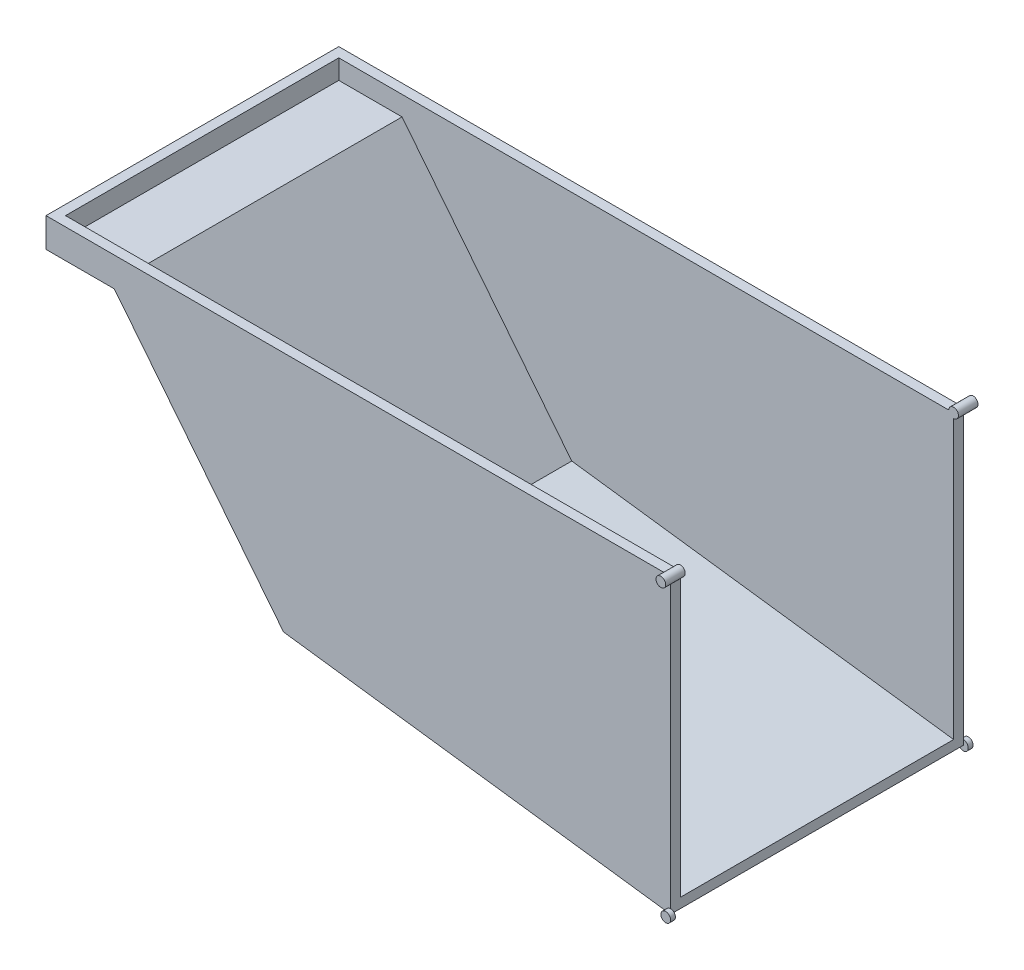
ISO-10303-21;
HEADER;
FILE_DESCRIPTION(('STEP AP214'),'2;1');
FILE_NAME('part.step','',(''),(''),'','','');
FILE_SCHEMA(('AUTOMOTIVE_DESIGN { 1 0 10303 214 1 1 1 1 }'));
ENDSEC;
DATA;
#1=APPLICATION_CONTEXT('core data for automotive mechanical design processes');
#2=APPLICATION_PROTOCOL_DEFINITION('international standard','automotive_design',2000,#1);
#3=PRODUCT_CONTEXT('',#1,'mechanical');
#4=PRODUCT('Part','Part','',(#3));
#5=PRODUCT_RELATED_PRODUCT_CATEGORY('part','',(#4));
#6=PRODUCT_DEFINITION_FORMATION('','',#4);
#7=PRODUCT_DEFINITION_CONTEXT('part definition',#1,'design');
#8=PRODUCT_DEFINITION('design','',#6,#7);
#9=PRODUCT_DEFINITION_SHAPE('','',#8);
#10=(LENGTH_UNIT() NAMED_UNIT(*) SI_UNIT(.MILLI.,.METRE.));
#11=(NAMED_UNIT(*) PLANE_ANGLE_UNIT() SI_UNIT($,.RADIAN.));
#12=(NAMED_UNIT(*) SI_UNIT($,.STERADIAN.) SOLID_ANGLE_UNIT());
#13=UNCERTAINTY_MEASURE_WITH_UNIT(LENGTH_MEASURE(1.E-05),#10,'distance_accuracy_value','');
#14=(GEOMETRIC_REPRESENTATION_CONTEXT(3) GLOBAL_UNCERTAINTY_ASSIGNED_CONTEXT((#13)) GLOBAL_UNIT_ASSIGNED_CONTEXT((#10,
#11,#12)) REPRESENTATION_CONTEXT('',''));
#15=CARTESIAN_POINT('',(0.,0.,0.));
#16=DIRECTION('',(0.,0.,1.));
#17=DIRECTION('',(1.,0.,0.));
#18=AXIS2_PLACEMENT_3D('',#15,#16,#17);
#19=CARTESIAN_POINT('',(0.,135.,150.));
#20=DIRECTION('',(0.,1.,0.));
#21=DIRECTION('',(0.,0.,1.));
#22=AXIS2_PLACEMENT_3D('',#19,#20,#21);
#23=PLANE('',#22);
#24=DIRECTION('',(0.,0.,-1.));
#25=VECTOR('',#24,1.);
#26=CARTESIAN_POINT('',(18.75,135.,0.));
#27=LINE('',#26,#25);
#28=CARTESIAN_POINT('',(18.75,135.,76.));
#29=VERTEX_POINT('',#28);
#30=CARTESIAN_POINT('',(18.75,135.,74.));
#31=VERTEX_POINT('',#30);
#32=EDGE_CURVE('E57',#29,#31,#27,.T.);
#33=ORIENTED_EDGE('',*,*,#32,.T.);
#34=DIRECTION('',(1.,0.,0.));
#35=VECTOR('',#34,1.);
#36=CARTESIAN_POINT('',(0.,135.,74.));
#37=LINE('',#36,#35);
#38=CARTESIAN_POINT('',(16.25,135.,74.));
#39=VERTEX_POINT('',#38);
#40=EDGE_CURVE('E226',#39,#31,#37,.T.);
#41=ORIENTED_EDGE('',*,*,#40,.F.);
#42=DIRECTION('',(0.,0.,-1.));
#43=VECTOR('',#42,1.);
#44=CARTESIAN_POINT('',(16.25,135.,0.));
#45=LINE('',#44,#43);
#46=CARTESIAN_POINT('',(16.25,135.,76.));
#47=VERTEX_POINT('',#46);
#48=EDGE_CURVE('E223',#47,#39,#45,.T.);
#49=ORIENTED_EDGE('',*,*,#48,.F.);
#50=DIRECTION('',(1.,0.,0.));
#51=VECTOR('',#50,1.);
#52=CARTESIAN_POINT('',(0.,135.,76.));
#53=LINE('',#52,#51);
#54=EDGE_CURVE('E232',#47,#29,#53,.T.);
#55=ORIENTED_EDGE('',*,*,#54,.T.);
#56=EDGE_LOOP('',(#33,#41,#49,#55));
#57=FACE_BOUND('',#56,.T.);
#58=DIRECTION('',(1.,0.,0.));
#59=VECTOR('',#58,1.);
#60=CARTESIAN_POINT('',(0.,135.,0.));
#61=LINE('',#60,#59);
#62=CARTESIAN_POINT('',(0.,135.,0.));
#63=VERTEX_POINT('',#62);
#64=CARTESIAN_POINT('',(35.,135.,0.));
#65=VERTEX_POINT('',#64);
#66=EDGE_CURVE('E357',#63,#65,#61,.T.);
#67=ORIENTED_EDGE('',*,*,#66,.T.);
#68=DIRECTION('',(0.,0.,-1.));
#69=VECTOR('',#68,1.);
#70=CARTESIAN_POINT('',(35.,135.,150.));
#71=LINE('',#70,#69);
#72=CARTESIAN_POINT('',(35.,135.,150.));
#73=VERTEX_POINT('',#72);
#74=EDGE_CURVE('E378',#73,#65,#71,.T.);
#75=ORIENTED_EDGE('',*,*,#74,.F.);
#76=DIRECTION('',(1.,0.,0.));
#77=VECTOR('',#76,1.);
#78=CARTESIAN_POINT('',(0.,135.,150.));
#79=LINE('',#78,#77);
#80=CARTESIAN_POINT('',(0.,135.,150.));
#81=VERTEX_POINT('',#80);
#82=EDGE_CURVE('E375',#81,#73,#79,.T.);
#83=ORIENTED_EDGE('',*,*,#82,.F.);
#84=DIRECTION('',(0.,0.,-1.));
#85=VECTOR('',#84,1.);
#86=CARTESIAN_POINT('',(0.,135.,150.));
#87=LINE('',#86,#85);
#88=EDGE_CURVE('E405',#81,#63,#87,.T.);
#89=ORIENTED_EDGE('',*,*,#88,.T.);
#90=EDGE_LOOP('',(#67,#75,#83,#89));
#91=FACE_BOUND('',#90,.T.);
#92=ADVANCED_FACE('F41',(#57,#91),#23,.F.);
#93=CARTESIAN_POINT('',(320.,-1.1842378929335E-13,150.));
#94=DIRECTION('',(-1.,0.,0.));
#95=DIRECTION('',(0.,-1.,0.));
#96=AXIS2_PLACEMENT_3D('',#93,#94,#95);
#97=PLANE('',#96);
#98=DIRECTION('',(0.,1.,0.));
#99=VECTOR('',#98,1.);
#100=CARTESIAN_POINT('',(320.,-1.1842378929335E-13,0.));
#101=LINE('',#100,#99);
#102=CARTESIAN_POINT('',(320.,0.,0.));
#103=VERTEX_POINT('',#102);
#104=CARTESIAN_POINT('',(320.,2.50000000000005,0.));
#105=VERTEX_POINT('',#104);
#106=EDGE_CURVE('E388',#103,#105,#101,.T.);
#107=ORIENTED_EDGE('',*,*,#106,.T.);
#108=CARTESIAN_POINT('',(320.,147.5,0.));
#109=VERTEX_POINT('',#108);
#110=EDGE_CURVE('E387',#105,#109,#101,.T.);
#111=ORIENTED_EDGE('',*,*,#110,.T.);
#112=DIRECTION('',(0.,0.,-1.));
#113=VECTOR('',#112,1.);
#114=CARTESIAN_POINT('',(320.,147.5,5.));
#115=LINE('',#114,#113);
#116=CARTESIAN_POINT('',(320.,147.5,5.));
#117=VERTEX_POINT('',#116);
#118=EDGE_CURVE('E266',#109,#117,#115,.F.);
#119=ORIENTED_EDGE('',*,*,#118,.T.);
#120=DIRECTION('',(0.,1.,0.));
#121=VECTOR('',#120,1.);
#122=CARTESIAN_POINT('',(320.,-1.1842378929335E-13,5.));
#123=LINE('',#122,#121);
#124=CARTESIAN_POINT('',(320.,5.04314480290078,5.));
#125=VERTEX_POINT('',#124);
#126=EDGE_CURVE('E315',#125,#117,#123,.T.);
#127=ORIENTED_EDGE('',*,*,#126,.F.);
#128=DIRECTION('',(0.,0.,-1.));
#129=VECTOR('',#128,1.);
#130=CARTESIAN_POINT('',(320.,5.04314480290078,150.));
#131=LINE('',#130,#129);
#132=CARTESIAN_POINT('',(320.,5.04314480290078,145.));
#133=VERTEX_POINT('',#132);
#134=EDGE_CURVE('E300',#133,#125,#131,.T.);
#135=ORIENTED_EDGE('',*,*,#134,.F.);
#136=DIRECTION('',(0.,1.,0.));
#137=VECTOR('',#136,1.);
#138=CARTESIAN_POINT('',(320.,-1.1842378929335E-13,145.));
#139=LINE('',#138,#137);
#140=CARTESIAN_POINT('',(320.,147.5,145.));
#141=VERTEX_POINT('',#140);
#142=EDGE_CURVE('E318',#133,#141,#139,.T.);
#143=ORIENTED_EDGE('',*,*,#142,.T.);
#144=DIRECTION('',(0.,0.,1.));
#145=VECTOR('',#144,1.);
#146=CARTESIAN_POINT('',(320.,147.5,145.));
#147=LINE('',#146,#145);
#148=CARTESIAN_POINT('',(320.,147.5,150.));
#149=VERTEX_POINT('',#148);
#150=EDGE_CURVE('E286',#141,#149,#147,.T.);
#151=ORIENTED_EDGE('',*,*,#150,.T.);
#152=DIRECTION('',(0.,1.,0.));
#153=VECTOR('',#152,1.);
#154=CARTESIAN_POINT('',(320.,-1.1842378929335E-13,150.));
#155=LINE('',#154,#153);
#156=CARTESIAN_POINT('',(320.,2.50000000000005,150.));
#157=VERTEX_POINT('',#156);
#158=EDGE_CURVE('E362',#157,#149,#155,.T.);
#159=ORIENTED_EDGE('',*,*,#158,.F.);
#160=CARTESIAN_POINT('',(320.,0.,150.));
#161=VERTEX_POINT('',#160);
#162=EDGE_CURVE('E363',#161,#157,#155,.T.);
#163=ORIENTED_EDGE('',*,*,#162,.F.);
#164=DIRECTION('',(0.,0.,-1.));
#165=VECTOR('',#164,1.);
#166=CARTESIAN_POINT('',(320.,0.,150.));
#167=LINE('',#166,#165);
#168=EDGE_CURVE('E50',#161,#103,#167,.T.);
#169=ORIENTED_EDGE('',*,*,#168,.T.);
#170=EDGE_LOOP('',(#107,#111,#119,#127,#135,#143,#151,#159,#163,#169));
#171=FACE_BOUND('',#170,.T.);
#172=ADVANCED_FACE('F415',(#171),#97,.F.);
#173=CARTESIAN_POINT('',(0.,150.,150.));
#174=DIRECTION('',(0.,1.,0.));
#175=DIRECTION('',(-1.,0.,0.));
#176=AXIS2_PLACEMENT_3D('',#173,#174,#175);
#177=PLANE('',#176);
#178=DIRECTION('',(0.,0.,-1.));
#179=VECTOR('',#178,1.);
#180=CARTESIAN_POINT('',(317.5,150.,5.));
#181=LINE('',#180,#179);
#182=CARTESIAN_POINT('',(317.5,150.,0.));
#183=VERTEX_POINT('',#182);
#184=CARTESIAN_POINT('',(317.5,150.,5.));
#185=VERTEX_POINT('',#184);
#186=EDGE_CURVE('E263',#183,#185,#181,.F.);
#187=ORIENTED_EDGE('',*,*,#186,.F.);
#188=DIRECTION('',(1.,0.,0.));
#189=VECTOR('',#188,1.);
#190=CARTESIAN_POINT('',(0.,150.,0.));
#191=LINE('',#190,#189);
#192=CARTESIAN_POINT('',(0.,150.,0.));
#193=VERTEX_POINT('',#192);
#194=EDGE_CURVE('E392',#193,#183,#191,.T.);
#195=ORIENTED_EDGE('',*,*,#194,.F.);
#196=DIRECTION('',(0.,0.,-1.));
#197=VECTOR('',#196,1.);
#198=CARTESIAN_POINT('',(0.,150.,150.));
#199=LINE('',#198,#197);
#200=CARTESIAN_POINT('',(0.,150.,150.));
#201=VERTEX_POINT('',#200);
#202=EDGE_CURVE('E408',#201,#193,#199,.T.);
#203=ORIENTED_EDGE('',*,*,#202,.F.);
#204=DIRECTION('',(1.,0.,0.));
#205=VECTOR('',#204,1.);
#206=CARTESIAN_POINT('',(0.,150.,150.));
#207=LINE('',#206,#205);
#208=CARTESIAN_POINT('',(317.5,150.,150.));
#209=VERTEX_POINT('',#208);
#210=EDGE_CURVE('E367',#201,#209,#207,.T.);
#211=ORIENTED_EDGE('',*,*,#210,.T.);
#212=DIRECTION('',(0.,0.,1.));
#213=VECTOR('',#212,1.);
#214=CARTESIAN_POINT('',(317.5,150.,145.));
#215=LINE('',#214,#213);
#216=CARTESIAN_POINT('',(317.5,150.,145.));
#217=VERTEX_POINT('',#216);
#218=EDGE_CURVE('E282',#217,#209,#215,.T.);
#219=ORIENTED_EDGE('',*,*,#218,.F.);
#220=DIRECTION('',(1.,0.,0.));
#221=VECTOR('',#220,1.);
#222=CARTESIAN_POINT('',(0.,150.,145.));
#223=LINE('',#222,#221);
#224=CARTESIAN_POINT('',(5.00000000000006,150.,145.));
#225=VERTEX_POINT('',#224);
#226=EDGE_CURVE('E322',#225,#217,#223,.T.);
#227=ORIENTED_EDGE('',*,*,#226,.F.);
#228=DIRECTION('',(0.,0.,-1.));
#229=VECTOR('',#228,1.);
#230=CARTESIAN_POINT('',(5.00000000000006,150.,150.));
#231=LINE('',#230,#229);
#232=CARTESIAN_POINT('',(5.00000000000006,150.,5.));
#233=VERTEX_POINT('',#232);
#234=EDGE_CURVE('E332',#225,#233,#231,.T.);
#235=ORIENTED_EDGE('',*,*,#234,.T.);
#236=DIRECTION('',(1.,0.,0.));
#237=VECTOR('',#236,1.);
#238=CARTESIAN_POINT('',(0.,150.,5.));
#239=LINE('',#238,#237);
#240=EDGE_CURVE('E329',#233,#185,#239,.T.);
#241=ORIENTED_EDGE('',*,*,#240,.T.);
#242=EDGE_LOOP('',(#187,#195,#203,#211,#219,#227,#235,#241));
#243=FACE_BOUND('',#242,.T.);
#244=ADVANCED_FACE('F447',(#243),#177,.T.);
#245=CARTESIAN_POINT('',(87.2046490017046,69.4395637522798,150.));
#246=DIRECTION('',(0.782285282136838,0.622920329859355,0.));
#247=DIRECTION('',(-0.622920329859355,0.782285282136838,0.));
#248=AXIS2_PLACEMENT_3D('',#245,#246,#247);
#249=PLANE('',#248);
#250=DIRECTION('',(0.622920329859355,-0.782285282136838,0.));
#251=VECTOR('',#250,1.);
#252=CARTESIAN_POINT('',(87.2046490017046,69.4395637522798,0.));
#253=LINE('',#252,#251);
#254=CARTESIAN_POINT('',(121.711027725238,26.1052384440104,0.));
#255=VERTEX_POINT('',#254);
#256=EDGE_CURVE('E299',#65,#255,#253,.T.);
#257=ORIENTED_EDGE('',*,*,#256,.T.);
#258=DIRECTION('',(0.,0.,-1.));
#259=VECTOR('',#258,1.);
#260=CARTESIAN_POINT('',(121.711027725238,26.1052384440104,150.));
#261=LINE('',#260,#259);
#262=CARTESIAN_POINT('',(121.711027725238,26.1052384440104,150.));
#263=VERTEX_POINT('',#262);
#264=EDGE_CURVE('E11',#263,#255,#261,.T.);
#265=ORIENTED_EDGE('',*,*,#264,.F.);
#266=DIRECTION('',(0.622920329859355,-0.782285282136838,0.));
#267=VECTOR('',#266,1.);
#268=CARTESIAN_POINT('',(87.2046490017046,69.4395637522798,150.));
#269=LINE('',#268,#267);
#270=EDGE_CURVE('E352',#73,#263,#269,.T.);
#271=ORIENTED_EDGE('',*,*,#270,.F.);
#272=ORIENTED_EDGE('',*,*,#74,.T.);
#273=EDGE_LOOP('',(#257,#265,#271,#272));
#274=FACE_BOUND('',#273,.T.);
#275=ADVANCED_FACE('F43',(#274),#249,.F.);
#276=CARTESIAN_POINT('',(5.4518677937491,41.4110472164034,150.));
#277=DIRECTION('',(0.130526192220052,0.99144486137381,0.));
#278=DIRECTION('',(-0.99144486137381,0.130526192220052,0.));
#279=AXIS2_PLACEMENT_3D('',#276,#277,#278);
#280=PLANE('',#279);
#281=DIRECTION('',(0.99144486137381,-0.130526192220052,0.));
#282=VECTOR('',#281,1.);
#283=CARTESIAN_POINT('',(5.4518677937491,41.4110472164034,0.));
#284=LINE('',#283,#282);
#285=CARTESIAN_POINT('',(317.521387846565,0.32631548055016,0.));
#286=VERTEX_POINT('',#285);
#287=EDGE_CURVE('E383',#255,#286,#284,.T.);
#288=ORIENTED_EDGE('',*,*,#287,.T.);
#289=EDGE_CURVE('E382',#286,#103,#284,.T.);
#290=ORIENTED_EDGE('',*,*,#289,.T.);
#291=ORIENTED_EDGE('',*,*,#168,.F.);
#292=DIRECTION('',(0.99144486137381,-0.130526192220052,0.));
#293=VECTOR('',#292,1.);
#294=CARTESIAN_POINT('',(5.4518677937491,41.4110472164034,150.));
#295=LINE('',#294,#293);
#296=CARTESIAN_POINT('',(317.521387846565,0.326315480550164,150.));
#297=VERTEX_POINT('',#296);
#298=EDGE_CURVE('E356',#297,#161,#295,.T.);
#299=ORIENTED_EDGE('',*,*,#298,.F.);
#300=EDGE_CURVE('E358',#263,#297,#295,.T.);
#301=ORIENTED_EDGE('',*,*,#300,.F.);
#302=ORIENTED_EDGE('',*,*,#264,.T.);
#303=EDGE_LOOP('',(#288,#290,#291,#299,#301,#302));
#304=FACE_BOUND('',#303,.T.);
#305=ADVANCED_FACE('F420',(#304),#280,.F.);
#306=CARTESIAN_POINT('',(0.,0.,150.));
#307=DIRECTION('',(-1.,0.,0.));
#308=DIRECTION('',(0.,-1.,0.));
#309=AXIS2_PLACEMENT_3D('',#306,#307,#308);
#310=PLANE('',#309);
#311=DIRECTION('',(0.,1.,0.));
#312=VECTOR('',#311,1.);
#313=CARTESIAN_POINT('',(0.,0.,0.));
#314=LINE('',#313,#312);
#315=EDGE_CURVE('E396',#63,#193,#314,.T.);
#316=ORIENTED_EDGE('',*,*,#315,.F.);
#317=ORIENTED_EDGE('',*,*,#88,.F.);
#318=DIRECTION('',(0.,1.,0.));
#319=VECTOR('',#318,1.);
#320=CARTESIAN_POINT('',(0.,0.,150.));
#321=LINE('',#320,#319);
#322=EDGE_CURVE('E371',#81,#201,#321,.T.);
#323=ORIENTED_EDGE('',*,*,#322,.T.);
#324=ORIENTED_EDGE('',*,*,#202,.T.);
#325=EDGE_LOOP('',(#316,#317,#323,#324));
#326=FACE_BOUND('',#325,.T.);
#327=ADVANCED_FACE('F493',(#326),#310,.T.);
#328=CARTESIAN_POINT('',(0.,0.,150.));
#329=DIRECTION('',(0.,0.,1.));
#330=DIRECTION('',(1.,0.,0.));
#331=AXIS2_PLACEMENT_3D('',#328,#329,#330);
#332=PLANE('',#331);
#333=ORIENTED_EDGE('',*,*,#300,.T.);
#334=CARTESIAN_POINT('',(320.,0.,150.));
#335=DIRECTION('',(0.,0.,1.));
#336=DIRECTION('',(1.,0.,0.));
#337=AXIS2_PLACEMENT_3D('',#334,#335,#336);
#338=CIRCLE('',#337,2.50000000000002);
#339=EDGE_CURVE('E249',#157,#297,#338,.T.);
#340=ORIENTED_EDGE('',*,*,#339,.F.);
#341=ORIENTED_EDGE('',*,*,#158,.T.);
#342=CARTESIAN_POINT('',(320.,150.,150.));
#343=DIRECTION('',(0.,0.,1.));
#344=DIRECTION('',(1.,0.,0.));
#345=AXIS2_PLACEMENT_3D('',#342,#343,#344);
#346=CIRCLE('',#345,2.50000000000002);
#347=EDGE_CURVE('E278',#209,#149,#346,.T.);
#348=ORIENTED_EDGE('',*,*,#347,.F.);
#349=ORIENTED_EDGE('',*,*,#210,.F.);
#350=ORIENTED_EDGE('',*,*,#322,.F.);
#351=ORIENTED_EDGE('',*,*,#82,.T.);
#352=ORIENTED_EDGE('',*,*,#270,.T.);
#353=EDGE_LOOP('',(#333,#340,#341,#348,#349,#350,#351,#352));
#354=FACE_BOUND('',#353,.T.);
#355=ADVANCED_FACE('F436',(#354),#332,.T.);
#356=CARTESIAN_POINT('',(0.,0.,0.));
#357=DIRECTION('',(0.,0.,1.));
#358=DIRECTION('',(1.,0.,0.));
#359=AXIS2_PLACEMENT_3D('',#356,#357,#358);
#360=PLANE('',#359);
#361=ORIENTED_EDGE('',*,*,#110,.F.);
#362=CARTESIAN_POINT('',(320.,0.,0.));
#363=DIRECTION('',(0.,0.,1.));
#364=DIRECTION('',(1.,0.,0.));
#365=AXIS2_PLACEMENT_3D('',#362,#363,#364);
#366=CIRCLE('',#365,2.50000000000002);
#367=EDGE_CURVE('E240',#105,#286,#366,.T.);
#368=ORIENTED_EDGE('',*,*,#367,.T.);
#369=ORIENTED_EDGE('',*,*,#287,.F.);
#370=ORIENTED_EDGE('',*,*,#256,.F.);
#371=ORIENTED_EDGE('',*,*,#66,.F.);
#372=ORIENTED_EDGE('',*,*,#315,.T.);
#373=ORIENTED_EDGE('',*,*,#194,.T.);
#374=CARTESIAN_POINT('',(320.,150.,0.));
#375=DIRECTION('',(0.,0.,1.));
#376=DIRECTION('',(1.,0.,0.));
#377=AXIS2_PLACEMENT_3D('',#374,#375,#376);
#378=CIRCLE('',#377,2.50000000000002);
#379=EDGE_CURVE('E259',#183,#109,#378,.T.);
#380=ORIENTED_EDGE('',*,*,#379,.T.);
#381=EDGE_LOOP('',(#361,#368,#369,#370,#371,#372,#373,#380));
#382=FACE_BOUND('',#381,.T.);
#383=ADVANCED_FACE('F430',(#382),#360,.F.);
#384=CARTESIAN_POINT('',(91.1160754123888,72.5541654015766,150.));
#385=DIRECTION('',(0.782285282136838,0.622920329859355,0.));
#386=DIRECTION('',(-0.622920329859355,0.782285282136838,0.));
#387=AXIS2_PLACEMENT_3D('',#384,#385,#386);
#388=PLANE('',#387);
#389=DIRECTION('',(0.622920329859355,-0.782285282136838,0.));
#390=VECTOR('',#389,1.);
#391=CARTESIAN_POINT('',(91.1160754123888,72.5541654015766,5.));
#392=LINE('',#391,#390);
#393=CARTESIAN_POINT('',(37.4101160967175,140.,5.));
#394=VERTEX_POINT('',#393);
#395=CARTESIAN_POINT('',(124.365012543758,30.798979516994,5.));
#396=VERTEX_POINT('',#395);
#397=EDGE_CURVE('E290',#394,#396,#392,.T.);
#398=ORIENTED_EDGE('',*,*,#397,.F.);
#399=DIRECTION('',(0.,0.,-1.));
#400=VECTOR('',#399,1.);
#401=CARTESIAN_POINT('',(37.4101160967175,140.,150.));
#402=LINE('',#401,#400);
#403=CARTESIAN_POINT('',(37.4101160967175,140.,145.));
#404=VERTEX_POINT('',#403);
#405=EDGE_CURVE('E307',#404,#394,#402,.T.);
#406=ORIENTED_EDGE('',*,*,#405,.F.);
#407=DIRECTION('',(0.622920329859355,-0.782285282136838,0.));
#408=VECTOR('',#407,1.);
#409=CARTESIAN_POINT('',(91.1160754123888,72.5541654015766,145.));
#410=LINE('',#409,#408);
#411=CARTESIAN_POINT('',(124.365012543758,30.798979516994,145.));
#412=VERTEX_POINT('',#411);
#413=EDGE_CURVE('E301',#404,#412,#410,.T.);
#414=ORIENTED_EDGE('',*,*,#413,.T.);
#415=DIRECTION('',(0.,0.,-1.));
#416=VECTOR('',#415,1.);
#417=CARTESIAN_POINT('',(124.365012543758,30.798979516994,150.));
#418=LINE('',#417,#416);
#419=EDGE_CURVE('E295',#412,#396,#418,.T.);
#420=ORIENTED_EDGE('',*,*,#419,.T.);
#421=EDGE_LOOP('',(#398,#406,#414,#420));
#422=FACE_BOUND('',#421,.T.);
#423=ADVANCED_FACE('F470',(#422),#388,.T.);
#424=CARTESIAN_POINT('',(6.10449875484936,46.3682715232725,150.));
#425=DIRECTION('',(0.130526192220052,0.99144486137381,0.));
#426=DIRECTION('',(-0.99144486137381,0.130526192220052,0.));
#427=AXIS2_PLACEMENT_3D('',#424,#425,#426);
#428=PLANE('',#427);
#429=DIRECTION('',(0.99144486137381,-0.130526192220052,0.));
#430=VECTOR('',#429,1.);
#431=CARTESIAN_POINT('',(6.10449875484936,46.3682715232725,5.));
#432=LINE('',#431,#430);
#433=EDGE_CURVE('E294',#396,#125,#432,.T.);
#434=ORIENTED_EDGE('',*,*,#433,.F.);
#435=ORIENTED_EDGE('',*,*,#419,.F.);
#436=DIRECTION('',(0.99144486137381,-0.130526192220052,0.));
#437=VECTOR('',#436,1.);
#438=CARTESIAN_POINT('',(6.10449875484936,46.3682715232725,145.));
#439=LINE('',#438,#437);
#440=EDGE_CURVE('E305',#412,#133,#439,.T.);
#441=ORIENTED_EDGE('',*,*,#440,.T.);
#442=ORIENTED_EDGE('',*,*,#134,.T.);
#443=EDGE_LOOP('',(#434,#435,#441,#442));
#444=FACE_BOUND('',#443,.T.);
#445=ADVANCED_FACE('F465',(#444),#428,.T.);
#446=CARTESIAN_POINT('',(5.,0.,150.));
#447=DIRECTION('',(-1.,0.,0.));
#448=DIRECTION('',(0.,-1.,0.));
#449=AXIS2_PLACEMENT_3D('',#446,#447,#448);
#450=PLANE('',#449);
#451=DIRECTION('',(0.,1.,0.));
#452=VECTOR('',#451,1.);
#453=CARTESIAN_POINT('',(5.,0.,5.));
#454=LINE('',#453,#452);
#455=CARTESIAN_POINT('',(5.00000000000005,140.,5.));
#456=VERTEX_POINT('',#455);
#457=EDGE_CURVE('E325',#456,#233,#454,.T.);
#458=ORIENTED_EDGE('',*,*,#457,.T.);
#459=ORIENTED_EDGE('',*,*,#234,.F.);
#460=DIRECTION('',(0.,1.,0.));
#461=VECTOR('',#460,1.);
#462=CARTESIAN_POINT('',(5.,0.,145.));
#463=LINE('',#462,#461);
#464=CARTESIAN_POINT('',(5.00000000000005,140.,145.));
#465=VERTEX_POINT('',#464);
#466=EDGE_CURVE('E319',#465,#225,#463,.T.);
#467=ORIENTED_EDGE('',*,*,#466,.F.);
#468=DIRECTION('',(0.,0.,-1.));
#469=VECTOR('',#468,1.);
#470=CARTESIAN_POINT('',(5.00000000000005,140.,150.));
#471=LINE('',#470,#469);
#472=EDGE_CURVE('E311',#465,#456,#471,.T.);
#473=ORIENTED_EDGE('',*,*,#472,.T.);
#474=EDGE_LOOP('',(#458,#459,#467,#473));
#475=FACE_BOUND('',#474,.T.);
#476=ADVANCED_FACE('F455',(#475),#450,.F.);
#477=CARTESIAN_POINT('',(0.,140.,150.));
#478=DIRECTION('',(0.,1.,0.));
#479=DIRECTION('',(0.,0.,1.));
#480=AXIS2_PLACEMENT_3D('',#477,#478,#479);
#481=PLANE('',#480);
#482=DIRECTION('',(1.,0.,0.));
#483=VECTOR('',#482,1.);
#484=CARTESIAN_POINT('',(0.,140.,5.));
#485=LINE('',#484,#483);
#486=EDGE_CURVE('E306',#456,#394,#485,.T.);
#487=ORIENTED_EDGE('',*,*,#486,.F.);
#488=ORIENTED_EDGE('',*,*,#472,.F.);
#489=DIRECTION('',(1.,0.,0.));
#490=VECTOR('',#489,1.);
#491=CARTESIAN_POINT('',(0.,140.,145.));
#492=LINE('',#491,#490);
#493=EDGE_CURVE('E312',#465,#404,#492,.T.);
#494=ORIENTED_EDGE('',*,*,#493,.T.);
#495=ORIENTED_EDGE('',*,*,#405,.T.);
#496=EDGE_LOOP('',(#487,#488,#494,#495));
#497=FACE_BOUND('',#496,.T.);
#498=ADVANCED_FACE('F473',(#497),#481,.T.);
#499=CARTESIAN_POINT('',(0.,0.,145.));
#500=DIRECTION('',(0.,0.,1.));
#501=DIRECTION('',(1.,0.,0.));
#502=AXIS2_PLACEMENT_3D('',#499,#500,#501);
#503=PLANE('',#502);
#504=ORIENTED_EDGE('',*,*,#226,.T.);
#505=CARTESIAN_POINT('',(320.,150.,145.));
#506=DIRECTION('',(0.,0.,1.));
#507=DIRECTION('',(1.,0.,0.));
#508=AXIS2_PLACEMENT_3D('',#505,#506,#507);
#509=CIRCLE('',#508,2.50000000000002);
#510=EDGE_CURVE('E274',#141,#217,#509,.T.);
#511=ORIENTED_EDGE('',*,*,#510,.F.);
#512=ORIENTED_EDGE('',*,*,#142,.F.);
#513=ORIENTED_EDGE('',*,*,#440,.F.);
#514=ORIENTED_EDGE('',*,*,#413,.F.);
#515=ORIENTED_EDGE('',*,*,#493,.F.);
#516=ORIENTED_EDGE('',*,*,#466,.T.);
#517=EDGE_LOOP('',(#504,#511,#512,#513,#514,#515,#516));
#518=FACE_BOUND('',#517,.T.);
#519=ADVANCED_FACE('F449',(#518),#503,.F.);
#520=CARTESIAN_POINT('',(0.,0.,5.));
#521=DIRECTION('',(0.,0.,1.));
#522=DIRECTION('',(1.,0.,0.));
#523=AXIS2_PLACEMENT_3D('',#520,#521,#522);
#524=PLANE('',#523);
#525=ORIENTED_EDGE('',*,*,#126,.T.);
#526=CARTESIAN_POINT('',(320.,150.,5.));
#527=DIRECTION('',(0.,0.,-1.));
#528=DIRECTION('',(-1.,0.,0.));
#529=AXIS2_PLACEMENT_3D('',#526,#527,#528);
#530=CIRCLE('',#529,2.50000000000002);
#531=EDGE_CURVE('E256',#185,#117,#530,.T.);
#532=ORIENTED_EDGE('',*,*,#531,.F.);
#533=ORIENTED_EDGE('',*,*,#240,.F.);
#534=ORIENTED_EDGE('',*,*,#457,.F.);
#535=ORIENTED_EDGE('',*,*,#486,.T.);
#536=ORIENTED_EDGE('',*,*,#397,.T.);
#537=ORIENTED_EDGE('',*,*,#433,.T.);
#538=EDGE_LOOP('',(#525,#532,#533,#534,#535,#536,#537));
#539=FACE_BOUND('',#538,.T.);
#540=ADVANCED_FACE('F460',(#539),#524,.T.);
#541=CARTESIAN_POINT('',(320.,150.,145.));
#542=DIRECTION('',(0.,0.,1.));
#543=DIRECTION('',(1.,0.,0.));
#544=AXIS2_PLACEMENT_3D('',#541,#542,#543);
#545=CYLINDRICAL_SURFACE('',#544,2.50000000000002);
#546=CARTESIAN_POINT('',(320.,150.,155.));
#547=DIRECTION('',(0.,0.,1.));
#548=DIRECTION('',(1.,0.,0.));
#549=AXIS2_PLACEMENT_3D('',#546,#547,#548);
#550=CIRCLE('',#549,2.50000000000002);
#551=CARTESIAN_POINT('',(322.5,150.,155.));
#552=VERTEX_POINT('',#551);
#553=EDGE_CURVE('E270',#552,#552,#550,.T.);
#554=ORIENTED_EDGE('',*,*,#553,.F.);
#555=EDGE_LOOP('',(#554));
#556=FACE_BOUND('',#555,.T.);
#557=ORIENTED_EDGE('',*,*,#150,.F.);
#558=ORIENTED_EDGE('',*,*,#510,.T.);
#559=ORIENTED_EDGE('',*,*,#218,.T.);
#560=ORIENTED_EDGE('',*,*,#347,.T.);
#561=EDGE_LOOP('',(#557,#558,#559,#560));
#562=FACE_BOUND('',#561,.T.);
#563=ADVANCED_FACE('F443',(#556,#562),#545,.T.);
#564=CARTESIAN_POINT('',(320.,150.,155.));
#565=DIRECTION('',(0.,0.,1.));
#566=DIRECTION('',(1.,0.,0.));
#567=AXIS2_PLACEMENT_3D('',#564,#565,#566);
#568=PLANE('',#567);
#569=ORIENTED_EDGE('',*,*,#553,.T.);
#570=EDGE_LOOP('',(#569));
#571=FACE_BOUND('',#570,.T.);
#572=ADVANCED_FACE('F655',(#571),#568,.T.);
#573=CARTESIAN_POINT('',(320.,150.,5.));
#574=DIRECTION('',(0.,0.,-1.));
#575=DIRECTION('',(-1.,0.,0.));
#576=AXIS2_PLACEMENT_3D('',#573,#574,#575);
#577=CYLINDRICAL_SURFACE('',#576,2.50000000000002);
#578=CARTESIAN_POINT('',(320.,150.,-5.));
#579=DIRECTION('',(0.,0.,-1.));
#580=DIRECTION('',(-1.,0.,0.));
#581=AXIS2_PLACEMENT_3D('',#578,#579,#580);
#582=CIRCLE('',#581,2.50000000000002);
#583=CARTESIAN_POINT('',(317.5,150.,-5.));
#584=VERTEX_POINT('',#583);
#585=EDGE_CURVE('E248',#584,#584,#582,.T.);
#586=ORIENTED_EDGE('',*,*,#585,.F.);
#587=EDGE_LOOP('',(#586));
#588=FACE_BOUND('',#587,.T.);
#589=ORIENTED_EDGE('',*,*,#118,.F.);
#590=ORIENTED_EDGE('',*,*,#379,.F.);
#591=ORIENTED_EDGE('',*,*,#186,.T.);
#592=ORIENTED_EDGE('',*,*,#531,.T.);
#593=EDGE_LOOP('',(#589,#590,#591,#592));
#594=FACE_BOUND('',#593,.T.);
#595=ADVANCED_FACE('F463',(#588,#594),#577,.T.);
#596=CARTESIAN_POINT('',(320.,150.,-5.));
#597=DIRECTION('',(0.,0.,-1.));
#598=DIRECTION('',(-1.,0.,0.));
#599=AXIS2_PLACEMENT_3D('',#596,#597,#598);
#600=PLANE('',#599);
#601=ORIENTED_EDGE('',*,*,#585,.T.);
#602=EDGE_LOOP('',(#601));
#603=FACE_BOUND('',#602,.T.);
#604=ADVANCED_FACE('F645',(#603),#600,.T.);
#605=CARTESIAN_POINT('',(320.,0.,150.));
#606=DIRECTION('',(0.,0.,1.));
#607=DIRECTION('',(1.,0.,0.));
#608=AXIS2_PLACEMENT_3D('',#605,#606,#607);
#609=PLANE('',#608);
#610=ORIENTED_EDGE('',*,*,#298,.T.);
#611=ORIENTED_EDGE('',*,*,#162,.T.);
#612=EDGE_CURVE('E239',#297,#157,#338,.T.);
#613=ORIENTED_EDGE('',*,*,#612,.F.);
#614=EDGE_LOOP('',(#610,#611,#613));
#615=FACE_BOUND('',#614,.T.);
#616=ADVANCED_FACE('F642',(#615),#609,.F.);
#617=CARTESIAN_POINT('',(320.,0.,152.5));
#618=DIRECTION('',(0.,0.,-1.));
#619=DIRECTION('',(-1.,0.,0.));
#620=AXIS2_PLACEMENT_3D('',#617,#618,#619);
#621=CYLINDRICAL_SURFACE('',#620,2.50000000000002);
#622=CARTESIAN_POINT('',(320.,0.,152.5));
#623=DIRECTION('',(0.,0.,1.));
#624=DIRECTION('',(1.,0.,0.));
#625=AXIS2_PLACEMENT_3D('',#622,#623,#624);
#626=CIRCLE('',#625,2.50000000000002);
#627=CARTESIAN_POINT('',(322.5,0.,152.5));
#628=VERTEX_POINT('',#627);
#629=EDGE_CURVE('E244',#628,#628,#626,.T.);
#630=ORIENTED_EDGE('',*,*,#629,.F.);
#631=EDGE_LOOP('',(#630));
#632=FACE_BOUND('',#631,.T.);
#633=ORIENTED_EDGE('',*,*,#339,.T.);
#634=ORIENTED_EDGE('',*,*,#612,.T.);
#635=EDGE_LOOP('',(#633,#634));
#636=FACE_BOUND('',#635,.T.);
#637=ADVANCED_FACE('F640',(#632,#636),#621,.T.);
#638=CARTESIAN_POINT('',(320.,0.,152.5));
#639=DIRECTION('',(0.,0.,1.));
#640=DIRECTION('',(1.,0.,0.));
#641=AXIS2_PLACEMENT_3D('',#638,#639,#640);
#642=PLANE('',#641);
#643=ORIENTED_EDGE('',*,*,#629,.T.);
#644=EDGE_LOOP('',(#643));
#645=FACE_BOUND('',#644,.T.);
#646=ADVANCED_FACE('F530',(#645),#642,.T.);
#647=CARTESIAN_POINT('',(320.,0.,0.));
#648=DIRECTION('',(0.,0.,-1.));
#649=DIRECTION('',(1.,0.,0.));
#650=AXIS2_PLACEMENT_3D('',#647,#648,#649);
#651=PLANE('',#650);
#652=EDGE_CURVE('E64',#286,#105,#366,.T.);
#653=ORIENTED_EDGE('',*,*,#652,.T.);
#654=ORIENTED_EDGE('',*,*,#106,.F.);
#655=ORIENTED_EDGE('',*,*,#289,.F.);
#656=EDGE_LOOP('',(#653,#654,#655));
#657=FACE_BOUND('',#656,.T.);
#658=ADVANCED_FACE('F426',(#657),#651,.F.);
#659=CARTESIAN_POINT('',(320.,0.,-2.5));
#660=DIRECTION('',(0.,0.,1.));
#661=DIRECTION('',(1.,0.,0.));
#662=AXIS2_PLACEMENT_3D('',#659,#660,#661);
#663=CYLINDRICAL_SURFACE('',#662,2.50000000000002);
#664=CARTESIAN_POINT('',(320.,0.,-2.5));
#665=DIRECTION('',(0.,0.,1.));
#666=DIRECTION('',(1.,0.,0.));
#667=AXIS2_PLACEMENT_3D('',#664,#665,#666);
#668=CIRCLE('',#667,2.50000000000002);
#669=CARTESIAN_POINT('',(322.5,0.,-2.5));
#670=VERTEX_POINT('',#669);
#671=EDGE_CURVE('E235',#670,#670,#668,.T.);
#672=ORIENTED_EDGE('',*,*,#671,.T.);
#673=EDGE_LOOP('',(#672));
#674=FACE_BOUND('',#673,.T.);
#675=ORIENTED_EDGE('',*,*,#367,.F.);
#676=ORIENTED_EDGE('',*,*,#652,.F.);
#677=EDGE_LOOP('',(#675,#676));
#678=FACE_BOUND('',#677,.T.);
#679=ADVANCED_FACE('F428',(#674,#678),#663,.T.);
#680=CARTESIAN_POINT('',(320.,0.,-2.5));
#681=DIRECTION('',(0.,0.,-1.));
#682=DIRECTION('',(1.,0.,0.));
#683=AXIS2_PLACEMENT_3D('',#680,#681,#682);
#684=PLANE('',#683);
#685=ORIENTED_EDGE('',*,*,#671,.F.);
#686=EDGE_LOOP('',(#685));
#687=FACE_BOUND('',#686,.T.);
#688=ADVANCED_FACE('F563',(#687),#684,.T.);
#689=CARTESIAN_POINT('',(0.,129.5,74.));
#690=DIRECTION('',(0.,0.,1.));
#691=DIRECTION('',(1.,0.,0.));
#692=AXIS2_PLACEMENT_3D('',#689,#690,#691);
#693=PLANE('',#692);
#694=CARTESIAN_POINT('',(17.5,131.,74.));
#695=DIRECTION('',(0.,0.,1.));
#696=DIRECTION('',(1.,0.,0.));
#697=AXIS2_PLACEMENT_3D('',#694,#695,#696);
#698=CIRCLE('',#697,0.750000000000002);
#699=CARTESIAN_POINT('',(18.25,131.,74.));
#700=VERTEX_POINT('',#699);
#701=EDGE_CURVE('E219',#700,#700,#698,.T.);
#702=ORIENTED_EDGE('',*,*,#701,.T.);
#703=EDGE_LOOP('',(#702));
#704=FACE_BOUND('',#703,.T.);
#705=CARTESIAN_POINT('',(17.5,131.,74.));
#706=DIRECTION('',(0.,0.,1.));
#707=DIRECTION('',(1.,0.,0.));
#708=AXIS2_PLACEMENT_3D('',#705,#706,#707);
#709=CIRCLE('',#708,1.);
#710=CARTESIAN_POINT('',(18.4980823115217,130.938099277649,74.));
#711=VERTEX_POINT('',#710);
#712=CARTESIAN_POINT('',(16.5019176884783,130.938099277649,74.));
#713=VERTEX_POINT('',#712);
#714=EDGE_CURVE('E187',#711,#713,#709,.F.);
#715=ORIENTED_EDGE('',*,*,#714,.T.);
#716=DIRECTION('',(-0.0619007223505273,0.998082311521692,0.));
#717=VECTOR('',#716,1.);
#718=CARTESIAN_POINT('',(16.5275359725695,130.525032107639,74.));
#719=LINE('',#718,#717);
#720=EDGE_CURVE('E215',#713,#39,#719,.T.);
#721=ORIENTED_EDGE('',*,*,#720,.T.);
#722=ORIENTED_EDGE('',*,*,#40,.T.);
#723=DIRECTION('',(-0.0619007223505273,-0.998082311521692,0.));
#724=VECTOR('',#723,1.);
#725=CARTESIAN_POINT('',(18.3383545474674,128.362661545942,74.));
#726=LINE('',#725,#724);
#727=EDGE_CURVE('E209',#31,#711,#726,.T.);
#728=ORIENTED_EDGE('',*,*,#727,.T.);
#729=EDGE_LOOP('',(#715,#721,#722,#728));
#730=FACE_BOUND('',#729,.T.);
#731=ADVANCED_FACE('F572',(#704,#730),#693,.F.);
#732=CARTESIAN_POINT('',(0.,129.5,76.));
#733=DIRECTION('',(0.,0.,1.));
#734=DIRECTION('',(1.,0.,0.));
#735=AXIS2_PLACEMENT_3D('',#732,#733,#734);
#736=PLANE('',#735);
#737=CARTESIAN_POINT('',(17.5,131.,76.));
#738=DIRECTION('',(0.,0.,1.));
#739=DIRECTION('',(1.,0.,0.));
#740=AXIS2_PLACEMENT_3D('',#737,#738,#739);
#741=CIRCLE('',#740,0.750000000000002);
#742=CARTESIAN_POINT('',(18.25,131.,76.));
#743=VERTEX_POINT('',#742);
#744=EDGE_CURVE('E199',#743,#743,#741,.T.);
#745=ORIENTED_EDGE('',*,*,#744,.F.);
#746=EDGE_LOOP('',(#745));
#747=FACE_BOUND('',#746,.T.);
#748=DIRECTION('',(-0.0619007223505274,0.998082311521692,0.));
#749=VECTOR('',#748,1.);
#750=CARTESIAN_POINT('',(16.25,135.,76.));
#751=LINE('',#750,#749);
#752=CARTESIAN_POINT('',(16.5019176884783,130.938099277649,76.));
#753=VERTEX_POINT('',#752);
#754=EDGE_CURVE('E191',#753,#47,#751,.T.);
#755=ORIENTED_EDGE('',*,*,#754,.F.);
#756=CARTESIAN_POINT('',(17.5,131.,76.));
#757=DIRECTION('',(0.,0.,-1.));
#758=DIRECTION('',(1.,0.,0.));
#759=AXIS2_PLACEMENT_3D('',#756,#757,#758);
#760=CIRCLE('',#759,1.);
#761=CARTESIAN_POINT('',(18.4980823115217,130.938099277649,76.));
#762=VERTEX_POINT('',#761);
#763=EDGE_CURVE('E184',#762,#753,#760,.T.);
#764=ORIENTED_EDGE('',*,*,#763,.F.);
#765=DIRECTION('',(-0.0619007223505274,-0.998082311521692,0.));
#766=VECTOR('',#765,1.);
#767=CARTESIAN_POINT('',(18.75,135.,76.));
#768=LINE('',#767,#766);
#769=EDGE_CURVE('E193',#29,#762,#768,.T.);
#770=ORIENTED_EDGE('',*,*,#769,.F.);
#771=ORIENTED_EDGE('',*,*,#54,.F.);
#772=EDGE_LOOP('',(#755,#764,#770,#771));
#773=FACE_BOUND('',#772,.T.);
#774=ADVANCED_FACE('F201',(#747,#773),#736,.T.);
#775=CARTESIAN_POINT('',(16.25,135.,70.5));
#776=DIRECTION('',(0.998082311521692,0.0619007223505273,0.));
#777=DIRECTION('',(-0.0619007223505273,0.998082311521692,0.));
#778=AXIS2_PLACEMENT_3D('',#775,#776,#777);
#779=PLANE('',#778);
#780=DIRECTION('',(0.,0.,1.));
#781=VECTOR('',#780,1.);
#782=CARTESIAN_POINT('',(16.5019176884783,130.938099277649,70.5));
#783=LINE('',#782,#781);
#784=EDGE_CURVE('E190',#713,#753,#783,.T.);
#785=ORIENTED_EDGE('',*,*,#784,.T.);
#786=ORIENTED_EDGE('',*,*,#754,.T.);
#787=ORIENTED_EDGE('',*,*,#48,.T.);
#788=ORIENTED_EDGE('',*,*,#720,.F.);
#789=EDGE_LOOP('',(#785,#786,#787,#788));
#790=FACE_BOUND('',#789,.T.);
#791=ADVANCED_FACE('F596',(#790),#779,.F.);
#792=CARTESIAN_POINT('',(17.5,131.,70.5));
#793=DIRECTION('',(0.,0.,1.));
#794=DIRECTION('',(1.,0.,0.));
#795=AXIS2_PLACEMENT_3D('',#792,#793,#794);
#796=CYLINDRICAL_SURFACE('',#795,1.);
#797=DIRECTION('',(0.,0.,1.));
#798=VECTOR('',#797,1.);
#799=CARTESIAN_POINT('',(18.4980823115217,130.938099277649,70.5));
#800=LINE('',#799,#798);
#801=EDGE_CURVE('E180',#711,#762,#800,.T.);
#802=ORIENTED_EDGE('',*,*,#801,.T.);
#803=ORIENTED_EDGE('',*,*,#763,.T.);
#804=ORIENTED_EDGE('',*,*,#784,.F.);
#805=ORIENTED_EDGE('',*,*,#714,.F.);
#806=EDGE_LOOP('',(#802,#803,#804,#805));
#807=FACE_BOUND('',#806,.T.);
#808=ADVANCED_FACE('F181',(#807),#796,.T.);
#809=CARTESIAN_POINT('',(18.75,135.,70.5));
#810=DIRECTION('',(-0.998082311521692,0.0619007223505273,0.));
#811=DIRECTION('',(-0.0619007223505273,-0.998082311521692,0.));
#812=AXIS2_PLACEMENT_3D('',#809,#810,#811);
#813=PLANE('',#812);
#814=ORIENTED_EDGE('',*,*,#32,.F.);
#815=ORIENTED_EDGE('',*,*,#769,.T.);
#816=ORIENTED_EDGE('',*,*,#801,.F.);
#817=ORIENTED_EDGE('',*,*,#727,.F.);
#818=EDGE_LOOP('',(#814,#815,#816,#817));
#819=FACE_BOUND('',#818,.T.);
#820=ADVANCED_FACE('F194',(#819),#813,.F.);
#821=CARTESIAN_POINT('',(17.5,131.,70.5));
#822=DIRECTION('',(0.,0.,1.));
#823=DIRECTION('',(1.,0.,0.));
#824=AXIS2_PLACEMENT_3D('',#821,#822,#823);
#825=CYLINDRICAL_SURFACE('',#824,0.750000000000002);
#826=ORIENTED_EDGE('',*,*,#744,.T.);
#827=EDGE_LOOP('',(#826));
#828=FACE_BOUND('',#827,.T.);
#829=ORIENTED_EDGE('',*,*,#701,.F.);
#830=EDGE_LOOP('',(#829));
#831=FACE_BOUND('',#830,.T.);
#832=ADVANCED_FACE('F623',(#828,#831),#825,.F.);
#833=CLOSED_SHELL('',(#92,#172,#244,#275,#305,#327,#355,#383,#423,#445,#476,#498,#519,#540,#563,
#572,#595,#604,#616,#637,#646,#658,#679,#688,#731,#774,#791,#808,#820,#832));
#834=MANIFOLD_SOLID_BREP('B2',#833);
#835=ADVANCED_BREP_SHAPE_REPRESENTATION('',(#18,#834),#14);
#836=SHAPE_DEFINITION_REPRESENTATION(#9,#835);
ENDSEC;
END-ISO-10303-21;
